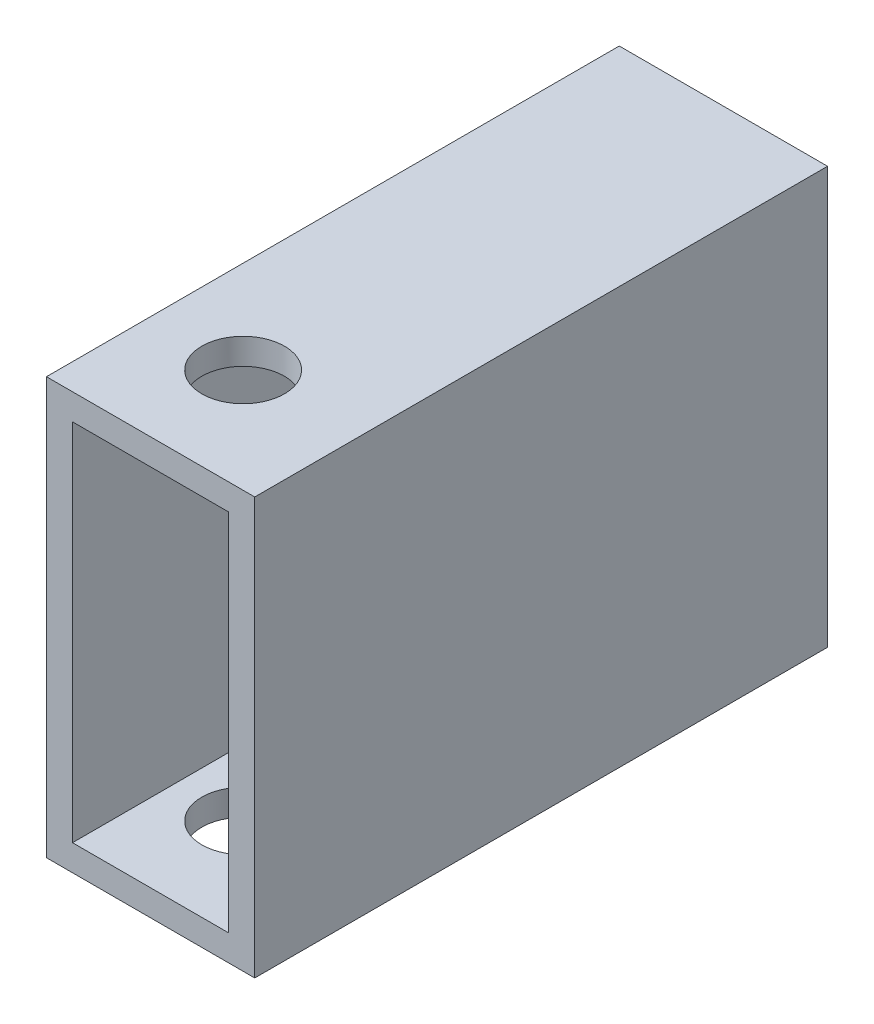
ISO-10303-21;
HEADER;
FILE_DESCRIPTION(('STEP AP214'),'2;1');
FILE_NAME('part.step','',(''),(''),'','','');
FILE_SCHEMA(('AUTOMOTIVE_DESIGN { 1 0 10303 214 1 1 1 1 }'));
ENDSEC;
DATA;
#1=APPLICATION_CONTEXT('core data for automotive mechanical design processes');
#2=APPLICATION_PROTOCOL_DEFINITION('international standard','automotive_design',2000,#1);
#3=PRODUCT_CONTEXT('',#1,'mechanical');
#4=PRODUCT('Part','Part','',(#3));
#5=PRODUCT_RELATED_PRODUCT_CATEGORY('part','',(#4));
#6=PRODUCT_DEFINITION_FORMATION('','',#4);
#7=PRODUCT_DEFINITION_CONTEXT('part definition',#1,'design');
#8=PRODUCT_DEFINITION('design','',#6,#7);
#9=PRODUCT_DEFINITION_SHAPE('','',#8);
#10=(LENGTH_UNIT() NAMED_UNIT(*) SI_UNIT(.MILLI.,.METRE.));
#11=(NAMED_UNIT(*) PLANE_ANGLE_UNIT() SI_UNIT($,.RADIAN.));
#12=(NAMED_UNIT(*) SI_UNIT($,.STERADIAN.) SOLID_ANGLE_UNIT());
#13=UNCERTAINTY_MEASURE_WITH_UNIT(LENGTH_MEASURE(1.E-05),#10,'distance_accuracy_value','');
#14=(GEOMETRIC_REPRESENTATION_CONTEXT(3) GLOBAL_UNCERTAINTY_ASSIGNED_CONTEXT((#13)) GLOBAL_UNIT_ASSIGNED_CONTEXT((#10,
#11,#12)) REPRESENTATION_CONTEXT('',''));
#15=CARTESIAN_POINT('',(0.,0.,0.));
#16=DIRECTION('',(0.,0.,1.));
#17=DIRECTION('',(1.,0.,0.));
#18=AXIS2_PLACEMENT_3D('',#15,#16,#17);
#19=CARTESIAN_POINT('',(0.,0.,69.85));
#20=DIRECTION('',(0.,0.,1.));
#21=DIRECTION('',(1.,0.,0.));
#22=AXIS2_PLACEMENT_3D('',#19,#20,#21);
#23=PLANE('',#22);
#24=DIRECTION('',(0.,1.,0.));
#25=VECTOR('',#24,1.);
#26=CARTESIAN_POINT('',(5.41065088757397,31.9002958579882,69.85));
#27=LINE('',#26,#25);
#28=CARTESIAN_POINT('',(5.41065088757398,-18.8997041420118,69.85));
#29=VERTEX_POINT('',#28);
#30=CARTESIAN_POINT('',(5.41065088757397,31.9002958579882,69.85));
#31=VERTEX_POINT('',#30);
#32=EDGE_CURVE('E136',#29,#31,#27,.T.);
#33=ORIENTED_EDGE('',*,*,#32,.T.);
#34=DIRECTION('',(-1.,0.,0.));
#35=VECTOR('',#34,1.);
#36=CARTESIAN_POINT('',(-19.989349112426,31.9002958579882,69.85));
#37=LINE('',#36,#35);
#38=CARTESIAN_POINT('',(-19.989349112426,31.9002958579882,69.85));
#39=VERTEX_POINT('',#38);
#40=EDGE_CURVE('E139',#31,#39,#37,.T.);
#41=ORIENTED_EDGE('',*,*,#40,.T.);
#42=DIRECTION('',(0.,-1.,0.));
#43=VECTOR('',#42,1.);
#44=CARTESIAN_POINT('',(-19.989349112426,31.9002958579882,69.85));
#45=LINE('',#44,#43);
#46=CARTESIAN_POINT('',(-19.989349112426,-18.8997041420118,69.85));
#47=VERTEX_POINT('',#46);
#48=EDGE_CURVE('E142',#39,#47,#45,.T.);
#49=ORIENTED_EDGE('',*,*,#48,.T.);
#50=DIRECTION('',(1.,0.,0.));
#51=VECTOR('',#50,1.);
#52=CARTESIAN_POINT('',(-19.989349112426,-18.8997041420118,69.85));
#53=LINE('',#52,#51);
#54=EDGE_CURVE('E144',#47,#29,#53,.T.);
#55=ORIENTED_EDGE('',*,*,#54,.T.);
#56=EDGE_LOOP('',(#33,#41,#49,#55));
#57=FACE_BOUND('',#56,.T.);
#58=DIRECTION('',(-1.,0.,0.));
#59=VECTOR('',#58,1.);
#60=CARTESIAN_POINT('',(2.23565088757397,28.7252958579882,69.85));
#61=LINE('',#60,#59);
#62=CARTESIAN_POINT('',(2.23565088757397,28.7252958579882,69.85));
#63=VERTEX_POINT('',#62);
#64=CARTESIAN_POINT('',(-16.814349112426,28.7252958579882,69.85));
#65=VERTEX_POINT('',#64);
#66=EDGE_CURVE('E106',#63,#65,#61,.T.);
#67=ORIENTED_EDGE('',*,*,#66,.F.);
#68=DIRECTION('',(0.,1.,0.));
#69=VECTOR('',#68,1.);
#70=CARTESIAN_POINT('',(2.23565088757397,28.7252958579882,69.85));
#71=LINE('',#70,#69);
#72=CARTESIAN_POINT('',(2.23565088757398,-15.7247041420118,69.85));
#73=VERTEX_POINT('',#72);
#74=EDGE_CURVE('E98',#73,#63,#71,.T.);
#75=ORIENTED_EDGE('',*,*,#74,.F.);
#76=DIRECTION('',(1.,0.,0.));
#77=VECTOR('',#76,1.);
#78=CARTESIAN_POINT('',(2.23565088757398,-15.7247041420118,69.85));
#79=LINE('',#78,#77);
#80=CARTESIAN_POINT('',(-16.814349112426,-15.7247041420118,69.85));
#81=VERTEX_POINT('',#80);
#82=EDGE_CURVE('E120',#81,#73,#79,.T.);
#83=ORIENTED_EDGE('',*,*,#82,.F.);
#84=DIRECTION('',(0.,-1.,0.));
#85=VECTOR('',#84,1.);
#86=CARTESIAN_POINT('',(-16.814349112426,28.7252958579882,69.85));
#87=LINE('',#86,#85);
#88=EDGE_CURVE('E118',#65,#81,#87,.T.);
#89=ORIENTED_EDGE('',*,*,#88,.F.);
#90=EDGE_LOOP('',(#67,#75,#83,#89));
#91=FACE_BOUND('',#90,.T.);
#92=ADVANCED_FACE('F32',(#57,#91),#23,.T.);
#93=CARTESIAN_POINT('',(0.,0.,0.));
#94=DIRECTION('',(0.,0.,1.));
#95=DIRECTION('',(1.,0.,0.));
#96=AXIS2_PLACEMENT_3D('',#93,#94,#95);
#97=PLANE('',#96);
#98=DIRECTION('',(0.,1.,0.));
#99=VECTOR('',#98,1.);
#100=CARTESIAN_POINT('',(5.41065088757397,31.9002958579882,0.));
#101=LINE('',#100,#99);
#102=CARTESIAN_POINT('',(5.41065088757398,-18.8997041420118,0.));
#103=VERTEX_POINT('',#102);
#104=CARTESIAN_POINT('',(5.41065088757397,31.9002958579882,0.));
#105=VERTEX_POINT('',#104);
#106=EDGE_CURVE('E114',#103,#105,#101,.T.);
#107=ORIENTED_EDGE('',*,*,#106,.F.);
#108=DIRECTION('',(1.,0.,0.));
#109=VECTOR('',#108,1.);
#110=CARTESIAN_POINT('',(-19.989349112426,-18.8997041420118,0.));
#111=LINE('',#110,#109);
#112=CARTESIAN_POINT('',(-19.989349112426,-18.8997041420118,0.));
#113=VERTEX_POINT('',#112);
#114=EDGE_CURVE('E140',#113,#103,#111,.T.);
#115=ORIENTED_EDGE('',*,*,#114,.F.);
#116=DIRECTION('',(0.,-1.,0.));
#117=VECTOR('',#116,1.);
#118=CARTESIAN_POINT('',(-19.989349112426,31.9002958579882,0.));
#119=LINE('',#118,#117);
#120=CARTESIAN_POINT('',(-19.989349112426,31.9002958579882,0.));
#121=VERTEX_POINT('',#120);
#122=EDGE_CURVE('E151',#121,#113,#119,.T.);
#123=ORIENTED_EDGE('',*,*,#122,.F.);
#124=DIRECTION('',(-1.,0.,0.));
#125=VECTOR('',#124,1.);
#126=CARTESIAN_POINT('',(-19.989349112426,31.9002958579882,0.));
#127=LINE('',#126,#125);
#128=EDGE_CURVE('E149',#105,#121,#127,.T.);
#129=ORIENTED_EDGE('',*,*,#128,.F.);
#130=EDGE_LOOP('',(#107,#115,#123,#129));
#131=FACE_BOUND('',#130,.T.);
#132=DIRECTION('',(0.,1.,0.));
#133=VECTOR('',#132,1.);
#134=CARTESIAN_POINT('',(2.23565088757397,28.7252958579882,0.));
#135=LINE('',#134,#133);
#136=CARTESIAN_POINT('',(2.23565088757398,-15.7247041420118,0.));
#137=VERTEX_POINT('',#136);
#138=CARTESIAN_POINT('',(2.23565088757397,28.7252958579882,0.));
#139=VERTEX_POINT('',#138);
#140=EDGE_CURVE('E56',#137,#139,#135,.T.);
#141=ORIENTED_EDGE('',*,*,#140,.T.);
#142=DIRECTION('',(-1.,0.,0.));
#143=VECTOR('',#142,1.);
#144=CARTESIAN_POINT('',(2.23565088757397,28.7252958579882,0.));
#145=LINE('',#144,#143);
#146=CARTESIAN_POINT('',(-16.814349112426,28.7252958579882,0.));
#147=VERTEX_POINT('',#146);
#148=EDGE_CURVE('E113',#139,#147,#145,.T.);
#149=ORIENTED_EDGE('',*,*,#148,.T.);
#150=DIRECTION('',(0.,-1.,0.));
#151=VECTOR('',#150,1.);
#152=CARTESIAN_POINT('',(-16.814349112426,28.7252958579882,0.));
#153=LINE('',#152,#151);
#154=CARTESIAN_POINT('',(-16.814349112426,-15.7247041420118,0.));
#155=VERTEX_POINT('',#154);
#156=EDGE_CURVE('E128',#147,#155,#153,.T.);
#157=ORIENTED_EDGE('',*,*,#156,.T.);
#158=DIRECTION('',(1.,0.,0.));
#159=VECTOR('',#158,1.);
#160=CARTESIAN_POINT('',(2.23565088757398,-15.7247041420118,0.));
#161=LINE('',#160,#159);
#162=EDGE_CURVE('E107',#155,#137,#161,.T.);
#163=ORIENTED_EDGE('',*,*,#162,.T.);
#164=EDGE_LOOP('',(#141,#149,#157,#163));
#165=FACE_BOUND('',#164,.T.);
#166=ADVANCED_FACE('F170',(#131,#165),#97,.F.);
#167=CARTESIAN_POINT('',(5.41065088757397,31.9002958579882,69.85));
#168=DIRECTION('',(-1.,0.,0.));
#169=DIRECTION('',(0.,-1.,0.));
#170=AXIS2_PLACEMENT_3D('',#167,#168,#169);
#171=PLANE('',#170);
#172=ORIENTED_EDGE('',*,*,#106,.T.);
#173=DIRECTION('',(0.,0.,-1.));
#174=VECTOR('',#173,1.);
#175=CARTESIAN_POINT('',(5.41065088757397,31.9002958579882,69.85));
#176=LINE('',#175,#174);
#177=EDGE_CURVE('E11',#31,#105,#176,.T.);
#178=ORIENTED_EDGE('',*,*,#177,.F.);
#179=ORIENTED_EDGE('',*,*,#32,.F.);
#180=DIRECTION('',(0.,0.,-1.));
#181=VECTOR('',#180,1.);
#182=CARTESIAN_POINT('',(5.41065088757398,-18.8997041420118,69.85));
#183=LINE('',#182,#181);
#184=EDGE_CURVE('E146',#29,#103,#183,.T.);
#185=ORIENTED_EDGE('',*,*,#184,.T.);
#186=EDGE_LOOP('',(#172,#178,#179,#185));
#187=FACE_BOUND('',#186,.T.);
#188=ADVANCED_FACE('F34',(#187),#171,.F.);
#189=CARTESIAN_POINT('',(-19.989349112426,31.9002958579882,69.85));
#190=DIRECTION('',(0.,-1.,0.));
#191=DIRECTION('',(0.,0.,-1.));
#192=AXIS2_PLACEMENT_3D('',#189,#190,#191);
#193=PLANE('',#192);
#194=CARTESIAN_POINT('',(-8.70528884360056,31.9002958579882,57.15));
#195=DIRECTION('',(0.,1.,0.));
#196=DIRECTION('',(0.,0.,1.));
#197=AXIS2_PLACEMENT_3D('',#194,#195,#196);
#198=CIRCLE('',#197,5.0419);
#199=CARTESIAN_POINT('',(-8.70528884360056,31.9002958579882,62.1919));
#200=VERTEX_POINT('',#199);
#201=EDGE_CURVE('E207',#200,#200,#198,.T.);
#202=ORIENTED_EDGE('',*,*,#201,.F.);
#203=EDGE_LOOP('',(#202));
#204=FACE_BOUND('',#203,.T.);
#205=ORIENTED_EDGE('',*,*,#128,.T.);
#206=DIRECTION('',(0.,0.,-1.));
#207=VECTOR('',#206,1.);
#208=CARTESIAN_POINT('',(-19.989349112426,31.9002958579882,69.85));
#209=LINE('',#208,#207);
#210=EDGE_CURVE('E41',#39,#121,#209,.T.);
#211=ORIENTED_EDGE('',*,*,#210,.F.);
#212=ORIENTED_EDGE('',*,*,#40,.F.);
#213=ORIENTED_EDGE('',*,*,#177,.T.);
#214=EDGE_LOOP('',(#205,#211,#212,#213));
#215=FACE_BOUND('',#214,.T.);
#216=ADVANCED_FACE('F180',(#204,#215),#193,.F.);
#217=CARTESIAN_POINT('',(-19.989349112426,31.9002958579882,69.85));
#218=DIRECTION('',(1.,0.,0.));
#219=DIRECTION('',(0.,1.,0.));
#220=AXIS2_PLACEMENT_3D('',#217,#218,#219);
#221=PLANE('',#220);
#222=ORIENTED_EDGE('',*,*,#122,.T.);
#223=DIRECTION('',(0.,0.,-1.));
#224=VECTOR('',#223,1.);
#225=CARTESIAN_POINT('',(-19.989349112426,-18.8997041420118,69.85));
#226=LINE('',#225,#224);
#227=EDGE_CURVE('E156',#47,#113,#226,.T.);
#228=ORIENTED_EDGE('',*,*,#227,.F.);
#229=ORIENTED_EDGE('',*,*,#48,.F.);
#230=ORIENTED_EDGE('',*,*,#210,.T.);
#231=EDGE_LOOP('',(#222,#228,#229,#230));
#232=FACE_BOUND('',#231,.T.);
#233=ADVANCED_FACE('F164',(#232),#221,.F.);
#234=CARTESIAN_POINT('',(-19.989349112426,-18.8997041420118,69.85));
#235=DIRECTION('',(0.,1.,0.));
#236=DIRECTION('',(0.,0.,1.));
#237=AXIS2_PLACEMENT_3D('',#234,#235,#236);
#238=PLANE('',#237);
#239=CARTESIAN_POINT('',(-8.70528884360056,-18.8997041420118,57.15));
#240=DIRECTION('',(0.,1.,0.));
#241=DIRECTION('',(0.,0.,1.));
#242=AXIS2_PLACEMENT_3D('',#239,#240,#241);
#243=CIRCLE('',#242,5.0419);
#244=CARTESIAN_POINT('',(-8.70528884360056,-18.8997041420118,62.1919));
#245=VERTEX_POINT('',#244);
#246=EDGE_CURVE('E205',#245,#245,#243,.F.);
#247=ORIENTED_EDGE('',*,*,#246,.F.);
#248=EDGE_LOOP('',(#247));
#249=FACE_BOUND('',#248,.T.);
#250=ORIENTED_EDGE('',*,*,#114,.T.);
#251=ORIENTED_EDGE('',*,*,#184,.F.);
#252=ORIENTED_EDGE('',*,*,#54,.F.);
#253=ORIENTED_EDGE('',*,*,#227,.T.);
#254=EDGE_LOOP('',(#250,#251,#252,#253));
#255=FACE_BOUND('',#254,.T.);
#256=ADVANCED_FACE('F174',(#249,#255),#238,.F.);
#257=CARTESIAN_POINT('',(2.23565088757397,28.7252958579882,69.85));
#258=DIRECTION('',(-1.,0.,0.));
#259=DIRECTION('',(0.,-1.,0.));
#260=AXIS2_PLACEMENT_3D('',#257,#258,#259);
#261=PLANE('',#260);
#262=ORIENTED_EDGE('',*,*,#140,.F.);
#263=DIRECTION('',(0.,0.,-1.));
#264=VECTOR('',#263,1.);
#265=CARTESIAN_POINT('',(2.23565088757398,-15.7247041420118,69.85));
#266=LINE('',#265,#264);
#267=EDGE_CURVE('E102',#73,#137,#266,.T.);
#268=ORIENTED_EDGE('',*,*,#267,.F.);
#269=ORIENTED_EDGE('',*,*,#74,.T.);
#270=DIRECTION('',(0.,0.,-1.));
#271=VECTOR('',#270,1.);
#272=CARTESIAN_POINT('',(2.23565088757397,28.7252958579882,69.85));
#273=LINE('',#272,#271);
#274=EDGE_CURVE('E101',#63,#139,#273,.T.);
#275=ORIENTED_EDGE('',*,*,#274,.T.);
#276=EDGE_LOOP('',(#262,#268,#269,#275));
#277=FACE_BOUND('',#276,.T.);
#278=ADVANCED_FACE('F100',(#277),#261,.T.);
#279=CARTESIAN_POINT('',(2.23565088757397,28.7252958579882,69.85));
#280=DIRECTION('',(0.,-1.,0.));
#281=DIRECTION('',(1.,0.,0.));
#282=AXIS2_PLACEMENT_3D('',#279,#280,#281);
#283=PLANE('',#282);
#284=CARTESIAN_POINT('',(-8.70528884360056,28.7252958579882,57.15));
#285=DIRECTION('',(0.,-1.,0.));
#286=DIRECTION('',(1.,0.,0.));
#287=AXIS2_PLACEMENT_3D('',#284,#285,#286);
#288=CIRCLE('',#287,5.0419);
#289=CARTESIAN_POINT('',(-3.66338884360056,28.7252958579882,57.15));
#290=VERTEX_POINT('',#289);
#291=EDGE_CURVE('E126',#290,#290,#288,.T.);
#292=ORIENTED_EDGE('',*,*,#291,.F.);
#293=EDGE_LOOP('',(#292));
#294=FACE_BOUND('',#293,.T.);
#295=ORIENTED_EDGE('',*,*,#148,.F.);
#296=ORIENTED_EDGE('',*,*,#274,.F.);
#297=ORIENTED_EDGE('',*,*,#66,.T.);
#298=DIRECTION('',(0.,0.,-1.));
#299=VECTOR('',#298,1.);
#300=CARTESIAN_POINT('',(-16.814349112426,28.7252958579882,69.85));
#301=LINE('',#300,#299);
#302=EDGE_CURVE('E115',#65,#147,#301,.T.);
#303=ORIENTED_EDGE('',*,*,#302,.T.);
#304=EDGE_LOOP('',(#295,#296,#297,#303));
#305=FACE_BOUND('',#304,.T.);
#306=ADVANCED_FACE('F110',(#294,#305),#283,.T.);
#307=CARTESIAN_POINT('',(-16.814349112426,28.7252958579882,69.85));
#308=DIRECTION('',(1.,0.,0.));
#309=DIRECTION('',(0.,1.,0.));
#310=AXIS2_PLACEMENT_3D('',#307,#308,#309);
#311=PLANE('',#310);
#312=ORIENTED_EDGE('',*,*,#156,.F.);
#313=ORIENTED_EDGE('',*,*,#302,.F.);
#314=ORIENTED_EDGE('',*,*,#88,.T.);
#315=DIRECTION('',(0.,0.,-1.));
#316=VECTOR('',#315,1.);
#317=CARTESIAN_POINT('',(-16.814349112426,-15.7247041420118,69.85));
#318=LINE('',#317,#316);
#319=EDGE_CURVE('E48',#81,#155,#318,.T.);
#320=ORIENTED_EDGE('',*,*,#319,.T.);
#321=EDGE_LOOP('',(#312,#313,#314,#320));
#322=FACE_BOUND('',#321,.T.);
#323=ADVANCED_FACE('F219',(#322),#311,.T.);
#324=CARTESIAN_POINT('',(2.23565088757398,-15.7247041420118,69.85));
#325=DIRECTION('',(0.,1.,0.));
#326=DIRECTION('',(-1.,0.,0.));
#327=AXIS2_PLACEMENT_3D('',#324,#325,#326);
#328=PLANE('',#327);
#329=CARTESIAN_POINT('',(-8.70528884360056,-15.7247041420118,57.15));
#330=DIRECTION('',(0.,1.,0.));
#331=DIRECTION('',(-1.,0.,0.));
#332=AXIS2_PLACEMENT_3D('',#329,#330,#331);
#333=CIRCLE('',#332,5.0419);
#334=CARTESIAN_POINT('',(-13.7471888436006,-15.7247041420118,57.15));
#335=VERTEX_POINT('',#334);
#336=EDGE_CURVE('E36',#335,#335,#333,.T.);
#337=ORIENTED_EDGE('',*,*,#336,.F.);
#338=EDGE_LOOP('',(#337));
#339=FACE_BOUND('',#338,.T.);
#340=ORIENTED_EDGE('',*,*,#162,.F.);
#341=ORIENTED_EDGE('',*,*,#319,.F.);
#342=ORIENTED_EDGE('',*,*,#82,.T.);
#343=ORIENTED_EDGE('',*,*,#267,.T.);
#344=EDGE_LOOP('',(#340,#341,#342,#343));
#345=FACE_BOUND('',#344,.T.);
#346=ADVANCED_FACE('F223',(#339,#345),#328,.T.);
#347=CARTESIAN_POINT('',(-8.70528884360056,-33.1603508622697,57.15));
#348=DIRECTION('',(0.,1.,0.));
#349=DIRECTION('',(0.,0.,1.));
#350=AXIS2_PLACEMENT_3D('',#347,#348,#349);
#351=CYLINDRICAL_SURFACE('',#350,5.0419);
#352=ORIENTED_EDGE('',*,*,#336,.T.);
#353=EDGE_LOOP('',(#352));
#354=FACE_BOUND('',#353,.T.);
#355=ORIENTED_EDGE('',*,*,#246,.T.);
#356=EDGE_LOOP('',(#355));
#357=FACE_BOUND('',#356,.T.);
#358=ADVANCED_FACE('F229',(#354,#357),#351,.F.);
#359=ORIENTED_EDGE('',*,*,#291,.T.);
#360=EDGE_LOOP('',(#359));
#361=FACE_BOUND('',#360,.T.);
#362=ORIENTED_EDGE('',*,*,#201,.T.);
#363=EDGE_LOOP('',(#362));
#364=FACE_BOUND('',#363,.T.);
#365=ADVANCED_FACE('F215',(#361,#364),#351,.F.);
#366=CLOSED_SHELL('',(#92,#166,#188,#216,#233,#256,#278,#306,#323,#346,#358,#365));
#367=MANIFOLD_SOLID_BREP('B2',#366);
#368=ADVANCED_BREP_SHAPE_REPRESENTATION('',(#18,#367),#14);
#369=SHAPE_DEFINITION_REPRESENTATION(#9,#368);
ENDSEC;
END-ISO-10303-21;
